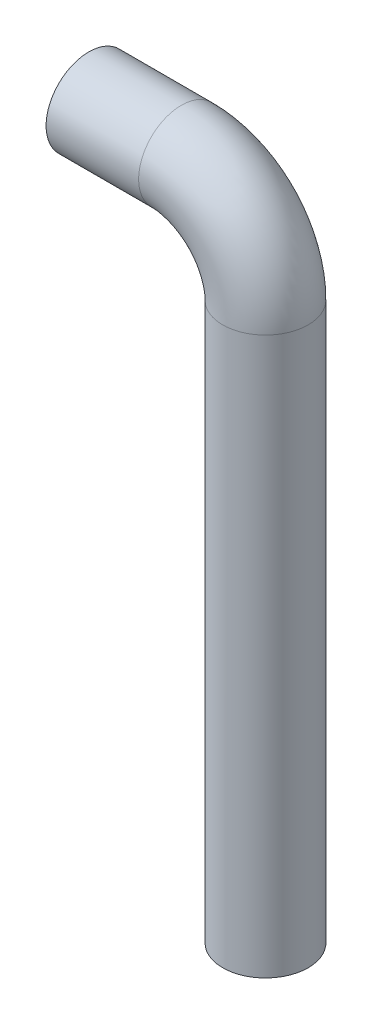
ISO-10303-21;
HEADER;
FILE_DESCRIPTION(('STEP AP214'),'2;1');
FILE_NAME('part.step','',(''),(''),'','','');
FILE_SCHEMA(('AUTOMOTIVE_DESIGN { 1 0 10303 214 1 1 1 1 }'));
ENDSEC;
DATA;
#1=APPLICATION_CONTEXT('core data for automotive mechanical design processes');
#2=APPLICATION_PROTOCOL_DEFINITION('international standard','automotive_design',2000,#1);
#3=PRODUCT_CONTEXT('',#1,'mechanical');
#4=PRODUCT('Part','Part','',(#3));
#5=PRODUCT_RELATED_PRODUCT_CATEGORY('part','',(#4));
#6=PRODUCT_DEFINITION_FORMATION('','',#4);
#7=PRODUCT_DEFINITION_CONTEXT('part definition',#1,'design');
#8=PRODUCT_DEFINITION('design','',#6,#7);
#9=PRODUCT_DEFINITION_SHAPE('','',#8);
#10=(LENGTH_UNIT() NAMED_UNIT(*) SI_UNIT(.MILLI.,.METRE.));
#11=(NAMED_UNIT(*) PLANE_ANGLE_UNIT() SI_UNIT($,.RADIAN.));
#12=(NAMED_UNIT(*) SI_UNIT($,.STERADIAN.) SOLID_ANGLE_UNIT());
#13=UNCERTAINTY_MEASURE_WITH_UNIT(LENGTH_MEASURE(1.E-05),#10,'distance_accuracy_value','');
#14=(GEOMETRIC_REPRESENTATION_CONTEXT(3) GLOBAL_UNCERTAINTY_ASSIGNED_CONTEXT((#13)) GLOBAL_UNIT_ASSIGNED_CONTEXT((#10,
#11,#12)) REPRESENTATION_CONTEXT('',''));
#15=CARTESIAN_POINT('',(0.,0.,0.));
#16=DIRECTION('',(0.,0.,1.));
#17=DIRECTION('',(1.,0.,0.));
#18=AXIS2_PLACEMENT_3D('',#15,#16,#17);
#19=CARTESIAN_POINT('',(0.,0.,0.));
#20=DIRECTION('',(1.,0.,0.));
#21=DIRECTION('',(0.,0.,-1.));
#22=AXIS2_PLACEMENT_3D('',#19,#20,#21);
#23=CYLINDRICAL_SURFACE('',#22,50.8);
#24=CARTESIAN_POINT('',(109.999999999999,0.,0.));
#25=DIRECTION('',(1.,0.,0.));
#26=DIRECTION('',(0.,0.,-1.));
#27=AXIS2_PLACEMENT_3D('',#24,#25,#26);
#28=CIRCLE('',#27,50.8);
#29=CARTESIAN_POINT('',(109.999999999999,50.8,0.));
#30=VERTEX_POINT('',#29);
#31=EDGE_CURVE('E64',#30,#30,#28,.T.);
#32=ORIENTED_EDGE('',*,*,#31,.F.);
#33=EDGE_LOOP('',(#32));
#34=FACE_BOUND('',#33,.T.);
#35=CARTESIAN_POINT('',(0.,0.,0.));
#36=DIRECTION('',(1.,0.,0.));
#37=DIRECTION('',(0.,0.,-1.));
#38=AXIS2_PLACEMENT_3D('',#35,#36,#37);
#39=CIRCLE('',#38,50.8);
#40=CARTESIAN_POINT('',(0.,0.,-50.8));
#41=VERTEX_POINT('',#40);
#42=EDGE_CURVE('E61',#41,#41,#39,.T.);
#43=ORIENTED_EDGE('',*,*,#42,.T.);
#44=EDGE_LOOP('',(#43));
#45=FACE_BOUND('',#44,.T.);
#46=ADVANCED_FACE('F36',(#34,#45),#23,.T.);
#47=CARTESIAN_POINT('',(110.,-100.,0.));
#48=DIRECTION('',(0.,0.,-1.));
#49=DIRECTION('',(-1.,0.,0.));
#50=AXIS2_PLACEMENT_3D('',#47,#48,#49);
#51=TOROIDAL_SURFACE('',#50,100.,50.8);
#52=CARTESIAN_POINT('',(210.,-100.000000000001,0.));
#53=DIRECTION('',(0.,-1.,0.));
#54=DIRECTION('',(0.,0.,-1.));
#55=AXIS2_PLACEMENT_3D('',#52,#53,#54);
#56=CIRCLE('',#55,50.8);
#57=CARTESIAN_POINT('',(260.8,-100.000000000001,0.));
#58=VERTEX_POINT('',#57);
#59=EDGE_CURVE('E40',#58,#58,#56,.T.);
#60=CARTESIAN_POINT('',(110.,-100.,0.));
#61=DIRECTION('',(0.,0.,-1.));
#62=DIRECTION('',(-1.,0.,0.));
#63=AXIS2_PLACEMENT_3D('',#60,#61,#62);
#64=CIRCLE('',#63,150.8);
#65=EDGE_CURVE('',#30,#58,#64,.T.);
#66=ORIENTED_EDGE('',*,*,#31,.T.);
#67=ORIENTED_EDGE('',*,*,#59,.F.);
#68=ORIENTED_EDGE('',*,*,#65,.T.);
#69=ORIENTED_EDGE('',*,*,#65,.F.);
#70=EDGE_LOOP('',(#66,#68,#67,#69));
#71=FACE_BOUND('',#70,.T.);
#72=ADVANCED_FACE('F76',(#71),#51,.T.);
#73=CARTESIAN_POINT('',(210.,-100.000000000001,0.));
#74=DIRECTION('',(0.,-1.,0.));
#75=DIRECTION('',(1.,0.,0.));
#76=AXIS2_PLACEMENT_3D('',#73,#74,#75);
#77=CYLINDRICAL_SURFACE('',#76,50.8);
#78=CARTESIAN_POINT('',(210.,-762.,0.));
#79=DIRECTION('',(0.,-1.,0.));
#80=DIRECTION('',(0.,0.,-1.));
#81=AXIS2_PLACEMENT_3D('',#78,#79,#80);
#82=CIRCLE('',#81,50.8);
#83=CARTESIAN_POINT('',(210.,-762.,-50.8));
#84=VERTEX_POINT('',#83);
#85=EDGE_CURVE('E56',#84,#84,#82,.T.);
#86=ORIENTED_EDGE('',*,*,#85,.F.);
#87=EDGE_LOOP('',(#86));
#88=FACE_BOUND('',#87,.T.);
#89=ORIENTED_EDGE('',*,*,#59,.T.);
#90=EDGE_LOOP('',(#89));
#91=FACE_BOUND('',#90,.T.);
#92=ADVANCED_FACE('F38',(#88,#91),#77,.T.);
#93=CARTESIAN_POINT('',(0.,0.,0.));
#94=DIRECTION('',(1.,0.,0.));
#95=DIRECTION('',(0.,0.,-1.));
#96=AXIS2_PLACEMENT_3D('',#93,#94,#95);
#97=PLANE('',#96);
#98=CARTESIAN_POINT('',(0.,0.,0.));
#99=DIRECTION('',(1.,0.,0.));
#100=DIRECTION('',(0.,0.,-1.));
#101=AXIS2_PLACEMENT_3D('',#98,#99,#100);
#102=CIRCLE('',#101,29.86);
#103=CARTESIAN_POINT('',(0.,0.,-29.86));
#104=VERTEX_POINT('',#103);
#105=EDGE_CURVE('E60',#104,#104,#102,.F.);
#106=ORIENTED_EDGE('',*,*,#105,.F.);
#107=EDGE_LOOP('',(#106));
#108=FACE_BOUND('',#107,.T.);
#109=ORIENTED_EDGE('',*,*,#42,.F.);
#110=EDGE_LOOP('',(#109));
#111=FACE_BOUND('',#110,.T.);
#112=ADVANCED_FACE('F82',(#108,#111),#97,.F.);
#113=CARTESIAN_POINT('',(210.,-762.,0.));
#114=DIRECTION('',(0.,-1.,0.));
#115=DIRECTION('',(0.,0.,-1.));
#116=AXIS2_PLACEMENT_3D('',#113,#114,#115);
#117=PLANE('',#116);
#118=CARTESIAN_POINT('',(210.,-762.,0.));
#119=DIRECTION('',(0.,-1.,0.));
#120=DIRECTION('',(0.,0.,-1.));
#121=AXIS2_PLACEMENT_3D('',#118,#119,#120);
#122=CIRCLE('',#121,29.86);
#123=CARTESIAN_POINT('',(210.,-762.,-29.86));
#124=VERTEX_POINT('',#123);
#125=EDGE_CURVE('E10',#124,#124,#122,.F.);
#126=ORIENTED_EDGE('',*,*,#125,.T.);
#127=EDGE_LOOP('',(#126));
#128=FACE_BOUND('',#127,.T.);
#129=ORIENTED_EDGE('',*,*,#85,.T.);
#130=EDGE_LOOP('',(#129));
#131=FACE_BOUND('',#130,.T.);
#132=ADVANCED_FACE('F100',(#128,#131),#117,.T.);
#133=CARTESIAN_POINT('',(0.,0.,0.));
#134=DIRECTION('',(1.,0.,0.));
#135=DIRECTION('',(0.,0.,-1.));
#136=AXIS2_PLACEMENT_3D('',#133,#134,#135);
#137=CYLINDRICAL_SURFACE('',#136,29.86);
#138=CARTESIAN_POINT('',(109.999999999999,0.,0.));
#139=DIRECTION('',(1.,0.,0.));
#140=DIRECTION('',(0.,0.,-1.));
#141=AXIS2_PLACEMENT_3D('',#138,#139,#140);
#142=CIRCLE('',#141,29.86);
#143=CARTESIAN_POINT('',(109.999999999999,29.86,0.));
#144=VERTEX_POINT('',#143);
#145=EDGE_CURVE('E52',#144,#144,#142,.F.);
#146=ORIENTED_EDGE('',*,*,#145,.F.);
#147=EDGE_LOOP('',(#146));
#148=FACE_BOUND('',#147,.T.);
#149=ORIENTED_EDGE('',*,*,#105,.T.);
#150=EDGE_LOOP('',(#149));
#151=FACE_BOUND('',#150,.T.);
#152=ADVANCED_FACE('F94',(#148,#151),#137,.F.);
#153=CARTESIAN_POINT('',(110.,-100.,0.));
#154=DIRECTION('',(0.,0.,-1.));
#155=DIRECTION('',(-1.,0.,0.));
#156=AXIS2_PLACEMENT_3D('',#153,#154,#155);
#157=TOROIDAL_SURFACE('',#156,100.,29.86);
#158=CARTESIAN_POINT('',(210.,-100.000000000001,0.));
#159=DIRECTION('',(0.,-1.,0.));
#160=DIRECTION('',(0.,0.,-1.));
#161=AXIS2_PLACEMENT_3D('',#158,#159,#160);
#162=CIRCLE('',#161,29.86);
#163=CARTESIAN_POINT('',(239.86,-100.000000000001,0.));
#164=VERTEX_POINT('',#163);
#165=EDGE_CURVE('E45',#164,#164,#162,.F.);
#166=CARTESIAN_POINT('',(110.,-100.,0.));
#167=DIRECTION('',(0.,0.,-1.));
#168=DIRECTION('',(-1.,0.,0.));
#169=AXIS2_PLACEMENT_3D('',#166,#167,#168);
#170=CIRCLE('',#169,129.86);
#171=EDGE_CURVE('',#144,#164,#170,.T.);
#172=ORIENTED_EDGE('',*,*,#145,.T.);
#173=ORIENTED_EDGE('',*,*,#165,.F.);
#174=ORIENTED_EDGE('',*,*,#171,.T.);
#175=ORIENTED_EDGE('',*,*,#171,.F.);
#176=EDGE_LOOP('',(#172,#174,#173,#175));
#177=FACE_BOUND('',#176,.T.);
#178=ADVANCED_FACE('F88',(#177),#157,.F.);
#179=CARTESIAN_POINT('',(210.,-100.000000000001,0.));
#180=DIRECTION('',(0.,-1.,0.));
#181=DIRECTION('',(1.,0.,0.));
#182=AXIS2_PLACEMENT_3D('',#179,#180,#181);
#183=CYLINDRICAL_SURFACE('',#182,29.86);
#184=ORIENTED_EDGE('',*,*,#125,.F.);
#185=EDGE_LOOP('',(#184));
#186=FACE_BOUND('',#185,.T.);
#187=ORIENTED_EDGE('',*,*,#165,.T.);
#188=EDGE_LOOP('',(#187));
#189=FACE_BOUND('',#188,.T.);
#190=ADVANCED_FACE('F86',(#186,#189),#183,.F.);
#191=CLOSED_SHELL('',(#46,#72,#92,#112,#132,#152,#178,#190));
#192=MANIFOLD_SOLID_BREP('B2',#191);
#193=ADVANCED_BREP_SHAPE_REPRESENTATION('',(#18,#192),#14);
#194=SHAPE_DEFINITION_REPRESENTATION(#9,#193);
ENDSEC;
END-ISO-10303-21;
